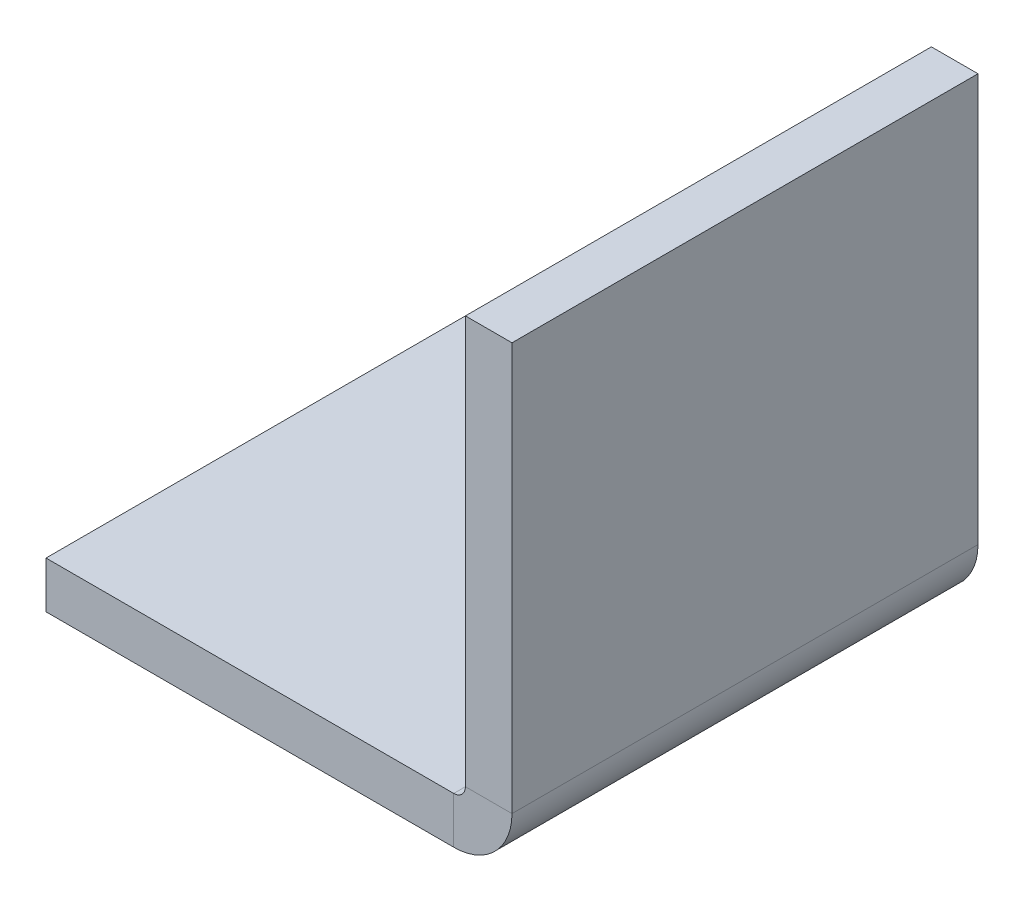
ISO-10303-21;
HEADER;
FILE_DESCRIPTION(('STEP AP214'),'2;1');
FILE_NAME('part.step','',(''),(''),'','','');
FILE_SCHEMA(('AUTOMOTIVE_DESIGN { 1 0 10303 214 1 1 1 1 }'));
ENDSEC;
DATA;
#1=APPLICATION_CONTEXT('core data for automotive mechanical design processes');
#2=APPLICATION_PROTOCOL_DEFINITION('international standard','automotive_design',2000,#1);
#3=PRODUCT_CONTEXT('',#1,'mechanical');
#4=PRODUCT('Part','Part','',(#3));
#5=PRODUCT_RELATED_PRODUCT_CATEGORY('part','',(#4));
#6=PRODUCT_DEFINITION_FORMATION('','',#4);
#7=PRODUCT_DEFINITION_CONTEXT('part definition',#1,'design');
#8=PRODUCT_DEFINITION('design','',#6,#7);
#9=PRODUCT_DEFINITION_SHAPE('','',#8);
#10=(LENGTH_UNIT() NAMED_UNIT(*) SI_UNIT(.MILLI.,.METRE.));
#11=(NAMED_UNIT(*) PLANE_ANGLE_UNIT() SI_UNIT($,.RADIAN.));
#12=(NAMED_UNIT(*) SI_UNIT($,.STERADIAN.) SOLID_ANGLE_UNIT());
#13=UNCERTAINTY_MEASURE_WITH_UNIT(LENGTH_MEASURE(1.E-05),#10,'distance_accuracy_value','');
#14=(GEOMETRIC_REPRESENTATION_CONTEXT(3) GLOBAL_UNCERTAINTY_ASSIGNED_CONTEXT((#13)) GLOBAL_UNIT_ASSIGNED_CONTEXT((#10,
#11,#12)) REPRESENTATION_CONTEXT('',''));
#15=CARTESIAN_POINT('',(0.,0.,0.));
#16=DIRECTION('',(0.,0.,1.));
#17=DIRECTION('',(1.,0.,0.));
#18=AXIS2_PLACEMENT_3D('',#15,#16,#17);
#19=CARTESIAN_POINT('',(-20.,-4.,-20.));
#20=DIRECTION('',(0.,0.,-1.));
#21=DIRECTION('',(-1.,0.,0.));
#22=AXIS2_PLACEMENT_3D('',#19,#20,#21);
#23=PLANE('',#22);
#24=DIRECTION('',(-1.,0.,0.));
#25=VECTOR('',#24,1.);
#26=CARTESIAN_POINT('',(-20.,0.,-20.));
#27=LINE('',#26,#25);
#28=CARTESIAN_POINT('',(15.,0.,-20.));
#29=VERTEX_POINT('',#28);
#30=CARTESIAN_POINT('',(-20.,0.,-20.));
#31=VERTEX_POINT('',#30);
#32=EDGE_CURVE('E104',#29,#31,#27,.T.);
#33=ORIENTED_EDGE('',*,*,#32,.F.);
#34=DIRECTION('',(0.,-1.,0.));
#35=VECTOR('',#34,1.);
#36=CARTESIAN_POINT('',(15.,0.,-20.));
#37=LINE('',#36,#35);
#38=CARTESIAN_POINT('',(15.,-4.00000000000002,-20.));
#39=VERTEX_POINT('',#38);
#40=EDGE_CURVE('E126',#29,#39,#37,.T.);
#41=ORIENTED_EDGE('',*,*,#40,.T.);
#42=DIRECTION('',(-1.,0.,0.));
#43=VECTOR('',#42,1.);
#44=CARTESIAN_POINT('',(-20.,-4.,-20.));
#45=LINE('',#44,#43);
#46=CARTESIAN_POINT('',(-20.,-4.,-20.));
#47=VERTEX_POINT('',#46);
#48=EDGE_CURVE('E113',#39,#47,#45,.T.);
#49=ORIENTED_EDGE('',*,*,#48,.T.);
#50=DIRECTION('',(0.,1.,0.));
#51=VECTOR('',#50,1.);
#52=CARTESIAN_POINT('',(-20.,-4.,-20.));
#53=LINE('',#52,#51);
#54=EDGE_CURVE('E64',#47,#31,#53,.T.);
#55=ORIENTED_EDGE('',*,*,#54,.T.);
#56=EDGE_LOOP('',(#33,#41,#49,#55));
#57=FACE_BOUND('',#56,.T.);
#58=ADVANCED_FACE('F61',(#57),#23,.T.);
#59=CARTESIAN_POINT('',(0.,-3.99999999999999,0.));
#60=DIRECTION('',(0.,1.,0.));
#61=DIRECTION('',(0.,0.,1.));
#62=AXIS2_PLACEMENT_3D('',#59,#60,#61);
#63=PLANE('',#62);
#64=DIRECTION('',(0.,0.,-1.));
#65=VECTOR('',#64,1.);
#66=CARTESIAN_POINT('',(15.,-4.00000000000002,-20.));
#67=LINE('',#66,#65);
#68=CARTESIAN_POINT('',(15.,-4.00000000000002,20.));
#69=VERTEX_POINT('',#68);
#70=EDGE_CURVE('E148',#39,#69,#67,.F.);
#71=ORIENTED_EDGE('',*,*,#70,.T.);
#72=DIRECTION('',(1.,0.,0.));
#73=VECTOR('',#72,1.);
#74=CARTESIAN_POINT('',(-20.,-4.,20.));
#75=LINE('',#74,#73);
#76=CARTESIAN_POINT('',(-20.,-4.,20.));
#77=VERTEX_POINT('',#76);
#78=EDGE_CURVE('E121',#77,#69,#75,.T.);
#79=ORIENTED_EDGE('',*,*,#78,.F.);
#80=DIRECTION('',(0.,0.,1.));
#81=VECTOR('',#80,1.);
#82=CARTESIAN_POINT('',(-20.,-4.,-20.));
#83=LINE('',#82,#81);
#84=EDGE_CURVE('E99',#47,#77,#83,.T.);
#85=ORIENTED_EDGE('',*,*,#84,.F.);
#86=ORIENTED_EDGE('',*,*,#48,.F.);
#87=EDGE_LOOP('',(#71,#79,#85,#86));
#88=FACE_BOUND('',#87,.T.);
#89=ADVANCED_FACE('F254',(#88),#63,.F.);
#90=CARTESIAN_POINT('',(0.,0.,0.));
#91=DIRECTION('',(0.,1.,0.));
#92=DIRECTION('',(0.,0.,1.));
#93=AXIS2_PLACEMENT_3D('',#90,#91,#92);
#94=PLANE('',#93);
#95=DIRECTION('',(1.,0.,0.));
#96=VECTOR('',#95,1.);
#97=CARTESIAN_POINT('',(-20.,0.,20.));
#98=LINE('',#97,#96);
#99=CARTESIAN_POINT('',(-20.,0.,20.));
#100=VERTEX_POINT('',#99);
#101=CARTESIAN_POINT('',(15.,0.,20.));
#102=VERTEX_POINT('',#101);
#103=EDGE_CURVE('E103',#100,#102,#98,.T.);
#104=ORIENTED_EDGE('',*,*,#103,.T.);
#105=DIRECTION('',(0.,0.,-1.));
#106=VECTOR('',#105,1.);
#107=CARTESIAN_POINT('',(15.,0.,-20.));
#108=LINE('',#107,#106);
#109=EDGE_CURVE('E76',#29,#102,#108,.F.);
#110=ORIENTED_EDGE('',*,*,#109,.F.);
#111=ORIENTED_EDGE('',*,*,#32,.T.);
#112=DIRECTION('',(0.,0.,1.));
#113=VECTOR('',#112,1.);
#114=CARTESIAN_POINT('',(-20.,0.,-20.));
#115=LINE('',#114,#113);
#116=EDGE_CURVE('E97',#31,#100,#115,.T.);
#117=ORIENTED_EDGE('',*,*,#116,.T.);
#118=EDGE_LOOP('',(#104,#110,#111,#117));
#119=FACE_BOUND('',#118,.T.);
#120=ADVANCED_FACE('F101',(#119),#94,.T.);
#121=CARTESIAN_POINT('',(-20.,-4.,20.));
#122=DIRECTION('',(0.,0.,1.));
#123=DIRECTION('',(1.,0.,0.));
#124=AXIS2_PLACEMENT_3D('',#121,#122,#123);
#125=PLANE('',#124);
#126=DIRECTION('',(0.,-1.,0.));
#127=VECTOR('',#126,1.);
#128=CARTESIAN_POINT('',(15.,0.,20.));
#129=LINE('',#128,#127);
#130=EDGE_CURVE('E111',#102,#69,#129,.T.);
#131=ORIENTED_EDGE('',*,*,#130,.F.);
#132=ORIENTED_EDGE('',*,*,#103,.F.);
#133=DIRECTION('',(0.,1.,0.));
#134=VECTOR('',#133,1.);
#135=CARTESIAN_POINT('',(-20.,-4.,20.));
#136=LINE('',#135,#134);
#137=EDGE_CURVE('E13',#77,#100,#136,.T.);
#138=ORIENTED_EDGE('',*,*,#137,.F.);
#139=ORIENTED_EDGE('',*,*,#78,.T.);
#140=EDGE_LOOP('',(#131,#132,#138,#139));
#141=FACE_BOUND('',#140,.T.);
#142=ADVANCED_FACE('F109',(#141),#125,.T.);
#143=CARTESIAN_POINT('',(-20.,-4.,-20.));
#144=DIRECTION('',(-1.,0.,0.));
#145=DIRECTION('',(0.,0.,1.));
#146=AXIS2_PLACEMENT_3D('',#143,#144,#145);
#147=PLANE('',#146);
#148=ORIENTED_EDGE('',*,*,#116,.F.);
#149=ORIENTED_EDGE('',*,*,#54,.F.);
#150=ORIENTED_EDGE('',*,*,#84,.T.);
#151=ORIENTED_EDGE('',*,*,#137,.T.);
#152=EDGE_LOOP('',(#148,#149,#150,#151));
#153=FACE_BOUND('',#152,.T.);
#154=ADVANCED_FACE('F95',(#153),#147,.T.);
#155=CARTESIAN_POINT('',(15.,1.,20.));
#156=DIRECTION('',(0.,0.,1.));
#157=DIRECTION('',(1.,0.,0.));
#158=AXIS2_PLACEMENT_3D('',#155,#156,#157);
#159=PLANE('',#158);
#160=DIRECTION('',(1.,0.,0.));
#161=VECTOR('',#160,1.);
#162=CARTESIAN_POINT('',(20.,0.999999999999973,20.));
#163=LINE('',#162,#161);
#164=CARTESIAN_POINT('',(16.,1.,20.));
#165=VERTEX_POINT('',#164);
#166=CARTESIAN_POINT('',(20.,0.999999999999973,20.));
#167=VERTEX_POINT('',#166);
#168=EDGE_CURVE('E155',#165,#167,#163,.T.);
#169=ORIENTED_EDGE('',*,*,#168,.F.);
#170=CARTESIAN_POINT('',(15.,1.,20.));
#171=DIRECTION('',(0.,0.,-1.));
#172=DIRECTION('',(-1.,0.,0.));
#173=AXIS2_PLACEMENT_3D('',#170,#171,#172);
#174=CIRCLE('',#173,1.);
#175=EDGE_CURVE('E140',#102,#165,#174,.F.);
#176=ORIENTED_EDGE('',*,*,#175,.F.);
#177=ORIENTED_EDGE('',*,*,#130,.T.);
#178=CARTESIAN_POINT('',(15.,1.,20.));
#179=DIRECTION('',(0.,0.,-1.));
#180=DIRECTION('',(-1.,0.,0.));
#181=AXIS2_PLACEMENT_3D('',#178,#179,#180);
#182=CIRCLE('',#181,5.);
#183=EDGE_CURVE('E130',#69,#167,#182,.F.);
#184=ORIENTED_EDGE('',*,*,#183,.T.);
#185=EDGE_LOOP('',(#169,#176,#177,#184));
#186=FACE_BOUND('',#185,.T.);
#187=ADVANCED_FACE('F245',(#186),#159,.T.);
#188=CARTESIAN_POINT('',(15.,1.,-20.));
#189=DIRECTION('',(0.,0.,1.));
#190=DIRECTION('',(1.,0.,0.));
#191=AXIS2_PLACEMENT_3D('',#188,#189,#190);
#192=PLANE('',#191);
#193=CARTESIAN_POINT('',(15.,1.,-20.));
#194=DIRECTION('',(0.,0.,-1.));
#195=DIRECTION('',(-1.,0.,0.));
#196=AXIS2_PLACEMENT_3D('',#193,#194,#195);
#197=CIRCLE('',#196,1.);
#198=CARTESIAN_POINT('',(16.,1.,-20.));
#199=VERTEX_POINT('',#198);
#200=EDGE_CURVE('E133',#199,#29,#197,.T.);
#201=ORIENTED_EDGE('',*,*,#200,.F.);
#202=DIRECTION('',(1.,0.,0.));
#203=VECTOR('',#202,1.);
#204=CARTESIAN_POINT('',(16.,1.,-20.));
#205=LINE('',#204,#203);
#206=CARTESIAN_POINT('',(20.,0.999999999999973,-20.));
#207=VERTEX_POINT('',#206);
#208=EDGE_CURVE('E163',#199,#207,#205,.T.);
#209=ORIENTED_EDGE('',*,*,#208,.T.);
#210=CARTESIAN_POINT('',(15.,1.,-20.));
#211=DIRECTION('',(0.,0.,-1.));
#212=DIRECTION('',(-1.,0.,0.));
#213=AXIS2_PLACEMENT_3D('',#210,#211,#212);
#214=CIRCLE('',#213,5.);
#215=EDGE_CURVE('E144',#207,#39,#214,.T.);
#216=ORIENTED_EDGE('',*,*,#215,.T.);
#217=ORIENTED_EDGE('',*,*,#40,.F.);
#218=EDGE_LOOP('',(#201,#209,#216,#217));
#219=FACE_BOUND('',#218,.T.);
#220=ADVANCED_FACE('F229',(#219),#192,.F.);
#221=CARTESIAN_POINT('',(15.,1.,-20.));
#222=DIRECTION('',(0.,0.,-1.));
#223=DIRECTION('',(1.,0.,0.));
#224=AXIS2_PLACEMENT_3D('',#221,#222,#223);
#225=CYLINDRICAL_SURFACE('',#224,5.);
#226=ORIENTED_EDGE('',*,*,#70,.F.);
#227=ORIENTED_EDGE('',*,*,#215,.F.);
#228=DIRECTION('',(0.,0.,-1.));
#229=VECTOR('',#228,1.);
#230=CARTESIAN_POINT('',(20.,0.999999999999973,0.));
#231=LINE('',#230,#229);
#232=EDGE_CURVE('E167',#167,#207,#231,.T.);
#233=ORIENTED_EDGE('',*,*,#232,.F.);
#234=ORIENTED_EDGE('',*,*,#183,.F.);
#235=EDGE_LOOP('',(#226,#227,#233,#234));
#236=FACE_BOUND('',#235,.T.);
#237=ADVANCED_FACE('F241',(#236),#225,.T.);
#238=CARTESIAN_POINT('',(15.,1.,-20.));
#239=DIRECTION('',(0.,0.,-1.));
#240=DIRECTION('',(1.,0.,0.));
#241=AXIS2_PLACEMENT_3D('',#238,#239,#240);
#242=CYLINDRICAL_SURFACE('',#241,1.);
#243=ORIENTED_EDGE('',*,*,#109,.T.);
#244=ORIENTED_EDGE('',*,*,#175,.T.);
#245=DIRECTION('',(0.,0.,1.));
#246=VECTOR('',#245,1.);
#247=CARTESIAN_POINT('',(16.,1.,20.));
#248=LINE('',#247,#246);
#249=EDGE_CURVE('E159',#165,#199,#248,.F.);
#250=ORIENTED_EDGE('',*,*,#249,.T.);
#251=ORIENTED_EDGE('',*,*,#200,.T.);
#252=EDGE_LOOP('',(#243,#244,#250,#251));
#253=FACE_BOUND('',#252,.T.);
#254=ADVANCED_FACE('F257',(#253),#242,.F.);
#255=CARTESIAN_POINT('',(20.,0.,-20.));
#256=DIRECTION('',(0.,0.,-1.));
#257=DIRECTION('',(-1.,0.,0.));
#258=AXIS2_PLACEMENT_3D('',#255,#256,#257);
#259=PLANE('',#258);
#260=DIRECTION('',(0.,-1.,0.));
#261=VECTOR('',#260,1.);
#262=CARTESIAN_POINT('',(20.,0.,-20.));
#263=LINE('',#262,#261);
#264=CARTESIAN_POINT('',(20.0000000000001,36.,-20.));
#265=VERTEX_POINT('',#264);
#266=EDGE_CURVE('E191',#265,#207,#263,.T.);
#267=ORIENTED_EDGE('',*,*,#266,.T.);
#268=ORIENTED_EDGE('',*,*,#208,.F.);
#269=DIRECTION('',(0.,1.,0.));
#270=VECTOR('',#269,1.);
#271=CARTESIAN_POINT('',(16.,0.,-20.));
#272=LINE('',#271,#270);
#273=CARTESIAN_POINT('',(16.0000000000001,36.,-20.));
#274=VERTEX_POINT('',#273);
#275=EDGE_CURVE('E179',#274,#199,#272,.F.);
#276=ORIENTED_EDGE('',*,*,#275,.F.);
#277=DIRECTION('',(-1.,0.,0.));
#278=VECTOR('',#277,1.);
#279=CARTESIAN_POINT('',(20.0000000000001,36.,-20.));
#280=LINE('',#279,#278);
#281=EDGE_CURVE('E137',#265,#274,#280,.T.);
#282=ORIENTED_EDGE('',*,*,#281,.F.);
#283=EDGE_LOOP('',(#267,#268,#276,#282));
#284=FACE_BOUND('',#283,.T.);
#285=ADVANCED_FACE('F222',(#284),#259,.T.);
#286=CARTESIAN_POINT('',(20.0000000000001,36.,20.));
#287=DIRECTION('',(0.,0.,1.));
#288=DIRECTION('',(1.,0.,0.));
#289=AXIS2_PLACEMENT_3D('',#286,#287,#288);
#290=PLANE('',#289);
#291=DIRECTION('',(0.,-1.,0.));
#292=VECTOR('',#291,1.);
#293=CARTESIAN_POINT('',(16.,0.,20.));
#294=LINE('',#293,#292);
#295=CARTESIAN_POINT('',(16.0000000000001,36.,20.));
#296=VERTEX_POINT('',#295);
#297=EDGE_CURVE('E171',#165,#296,#294,.F.);
#298=ORIENTED_EDGE('',*,*,#297,.F.);
#299=ORIENTED_EDGE('',*,*,#168,.T.);
#300=DIRECTION('',(0.,1.,0.));
#301=VECTOR('',#300,1.);
#302=CARTESIAN_POINT('',(20.0000000000001,36.,20.));
#303=LINE('',#302,#301);
#304=CARTESIAN_POINT('',(20.0000000000001,36.,20.));
#305=VERTEX_POINT('',#304);
#306=EDGE_CURVE('E183',#167,#305,#303,.T.);
#307=ORIENTED_EDGE('',*,*,#306,.T.);
#308=DIRECTION('',(-1.,0.,0.));
#309=VECTOR('',#308,1.);
#310=CARTESIAN_POINT('',(20.0000000000001,36.,20.));
#311=LINE('',#310,#309);
#312=EDGE_CURVE('E195',#305,#296,#311,.T.);
#313=ORIENTED_EDGE('',*,*,#312,.T.);
#314=EDGE_LOOP('',(#298,#299,#307,#313));
#315=FACE_BOUND('',#314,.T.);
#316=ADVANCED_FACE('F248',(#315),#290,.T.);
#317=CARTESIAN_POINT('',(20.,0.,0.));
#318=DIRECTION('',(1.,0.,0.));
#319=DIRECTION('',(0.,1.,0.));
#320=AXIS2_PLACEMENT_3D('',#317,#318,#319);
#321=PLANE('',#320);
#322=ORIENTED_EDGE('',*,*,#306,.F.);
#323=ORIENTED_EDGE('',*,*,#232,.T.);
#324=ORIENTED_EDGE('',*,*,#266,.F.);
#325=DIRECTION('',(0.,0.,-1.));
#326=VECTOR('',#325,1.);
#327=CARTESIAN_POINT('',(20.0000000000001,36.,-20.));
#328=LINE('',#327,#326);
#329=EDGE_CURVE('E187',#305,#265,#328,.T.);
#330=ORIENTED_EDGE('',*,*,#329,.F.);
#331=EDGE_LOOP('',(#322,#323,#324,#330));
#332=FACE_BOUND('',#331,.T.);
#333=ADVANCED_FACE('F237',(#332),#321,.T.);
#334=CARTESIAN_POINT('',(16.,0.,0.));
#335=DIRECTION('',(1.,0.,0.));
#336=DIRECTION('',(0.,1.,0.));
#337=AXIS2_PLACEMENT_3D('',#334,#335,#336);
#338=PLANE('',#337);
#339=ORIENTED_EDGE('',*,*,#249,.F.);
#340=ORIENTED_EDGE('',*,*,#297,.T.);
#341=DIRECTION('',(0.,0.,1.));
#342=VECTOR('',#341,1.);
#343=CARTESIAN_POINT('',(16.0000000000001,36.,0.));
#344=LINE('',#343,#342);
#345=EDGE_CURVE('E175',#296,#274,#344,.F.);
#346=ORIENTED_EDGE('',*,*,#345,.T.);
#347=ORIENTED_EDGE('',*,*,#275,.T.);
#348=EDGE_LOOP('',(#339,#340,#346,#347));
#349=FACE_BOUND('',#348,.T.);
#350=ADVANCED_FACE('F218',(#349),#338,.F.);
#351=CARTESIAN_POINT('',(20.0000000000001,36.,-20.));
#352=DIRECTION('',(0.,1.,0.));
#353=DIRECTION('',(-1.,0.,0.));
#354=AXIS2_PLACEMENT_3D('',#351,#352,#353);
#355=PLANE('',#354);
#356=ORIENTED_EDGE('',*,*,#345,.F.);
#357=ORIENTED_EDGE('',*,*,#312,.F.);
#358=ORIENTED_EDGE('',*,*,#329,.T.);
#359=ORIENTED_EDGE('',*,*,#281,.T.);
#360=EDGE_LOOP('',(#356,#357,#358,#359));
#361=FACE_BOUND('',#360,.T.);
#362=ADVANCED_FACE('F206',(#361),#355,.T.);
#363=CLOSED_SHELL('',(#58,#89,#120,#142,#154,#187,#220,#237,#254,#285,#316,#333,#350,#362));
#364=MANIFOLD_SOLID_BREP('B2',#363);
#365=ADVANCED_BREP_SHAPE_REPRESENTATION('',(#18,#364),#14);
#366=SHAPE_DEFINITION_REPRESENTATION(#9,#365);
ENDSEC;
END-ISO-10303-21;
